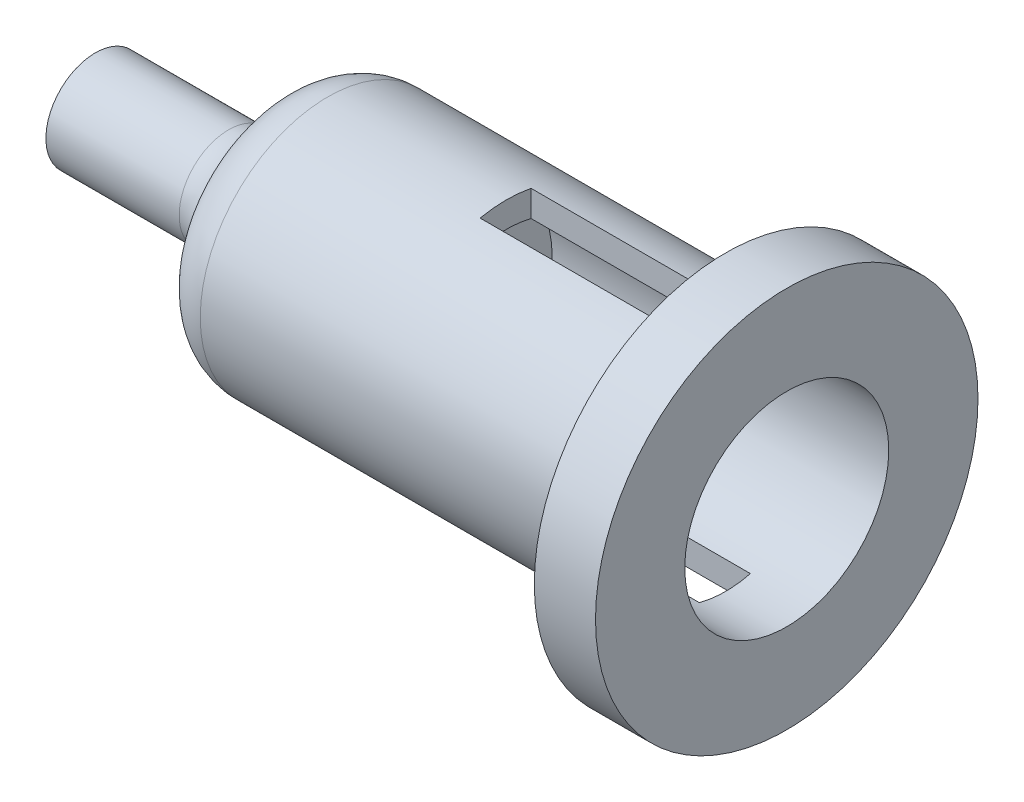
ISO-10303-21;
HEADER;
FILE_DESCRIPTION(('STEP AP214'),'2;1');
FILE_NAME('part.step','',(''),(''),'','','');
FILE_SCHEMA(('AUTOMOTIVE_DESIGN { 1 0 10303 214 1 1 1 1 }'));
ENDSEC;
DATA;
#1=APPLICATION_CONTEXT('core data for automotive mechanical design processes');
#2=APPLICATION_PROTOCOL_DEFINITION('international standard','automotive_design',2000,#1);
#3=PRODUCT_CONTEXT('',#1,'mechanical');
#4=PRODUCT('Part','Part','',(#3));
#5=PRODUCT_RELATED_PRODUCT_CATEGORY('part','',(#4));
#6=PRODUCT_DEFINITION_FORMATION('','',#4);
#7=PRODUCT_DEFINITION_CONTEXT('part definition',#1,'design');
#8=PRODUCT_DEFINITION('design','',#6,#7);
#9=PRODUCT_DEFINITION_SHAPE('','',#8);
#10=(LENGTH_UNIT() NAMED_UNIT(*) SI_UNIT(.MILLI.,.METRE.));
#11=(NAMED_UNIT(*) PLANE_ANGLE_UNIT() SI_UNIT($,.RADIAN.));
#12=(NAMED_UNIT(*) SI_UNIT($,.STERADIAN.) SOLID_ANGLE_UNIT());
#13=UNCERTAINTY_MEASURE_WITH_UNIT(LENGTH_MEASURE(1.E-05),#10,'distance_accuracy_value','');
#14=(GEOMETRIC_REPRESENTATION_CONTEXT(3) GLOBAL_UNCERTAINTY_ASSIGNED_CONTEXT((#13)) GLOBAL_UNIT_ASSIGNED_CONTEXT((#10,
#11,#12)) REPRESENTATION_CONTEXT('',''));
#15=CARTESIAN_POINT('',(0.,0.,0.));
#16=DIRECTION('',(0.,0.,1.));
#17=DIRECTION('',(1.,0.,0.));
#18=AXIS2_PLACEMENT_3D('',#15,#16,#17);
#19=CARTESIAN_POINT('',(-99.3636707278067,0.,0.));
#20=DIRECTION('',(-1.,0.,0.));
#21=DIRECTION('',(0.,0.,1.));
#22=AXIS2_PLACEMENT_3D('',#19,#20,#21);
#23=PLANE('',#22);
#24=CARTESIAN_POINT('',(-99.3636707278067,0.,0.));
#25=DIRECTION('',(1.,0.,0.));
#26=DIRECTION('',(0.,0.,-1.));
#27=AXIS2_PLACEMENT_3D('',#24,#25,#26);
#28=CIRCLE('',#27,9.69102467592188);
#29=CARTESIAN_POINT('',(-99.3636707278067,0.,-9.69102467592188));
#30=VERTEX_POINT('',#29);
#31=EDGE_CURVE('E159',#30,#30,#28,.T.);
#32=ORIENTED_EDGE('',*,*,#31,.F.);
#33=EDGE_LOOP('',(#32));
#34=FACE_BOUND('',#33,.T.);
#35=ADVANCED_FACE('F39',(#34),#23,.T.);
#36=CARTESIAN_POINT('',(-29.7890231832833,0.,0.));
#37=DIRECTION('',(1.,0.,0.));
#38=DIRECTION('',(0.,0.,-1.));
#39=AXIS2_PLACEMENT_3D('',#36,#37,#38);
#40=CYLINDRICAL_SURFACE('',#39,9.69102467592188);
#41=CARTESIAN_POINT('',(-73.2310983680441,0.,0.));
#42=DIRECTION('',(1.,0.,0.));
#43=DIRECTION('',(0.,0.,-1.));
#44=AXIS2_PLACEMENT_3D('',#41,#42,#43);
#45=CIRCLE('',#44,9.69102467592188);
#46=CARTESIAN_POINT('',(-73.2310983680441,0.,-9.69102467592188));
#47=VERTEX_POINT('',#46);
#48=EDGE_CURVE('E146',#47,#47,#45,.F.);
#49=ORIENTED_EDGE('',*,*,#48,.T.);
#50=EDGE_LOOP('',(#49));
#51=FACE_BOUND('',#50,.T.);
#52=ORIENTED_EDGE('',*,*,#31,.T.);
#53=EDGE_LOOP('',(#52));
#54=FACE_BOUND('',#53,.T.);
#55=ADVANCED_FACE('F246',(#51,#54),#40,.T.);
#56=CARTESIAN_POINT('',(-29.7890231832833,0.,0.));
#57=DIRECTION('',(1.,0.,0.));
#58=DIRECTION('',(0.,0.,-1.));
#59=AXIS2_PLACEMENT_3D('',#56,#57,#58);
#60=CYLINDRICAL_SURFACE('',#59,25.);
#61=DIRECTION('',(1.,0.,0.));
#62=VECTOR('',#61,1.);
#63=CARTESIAN_POINT('',(-29.7890231832833,-24.5204109466013,-4.8733404364762));
#64=LINE('',#63,#62);
#65=CARTESIAN_POINT('',(-18.7890231832833,-24.5204109466013,-4.8733404364762));
#66=VERTEX_POINT('',#65);
#67=CARTESIAN_POINT('',(24.2109768167167,-24.5204109466013,-4.8733404364762));
#68=VERTEX_POINT('',#67);
#69=EDGE_CURVE('E189',#66,#68,#64,.T.);
#70=ORIENTED_EDGE('',*,*,#69,.F.);
#71=CARTESIAN_POINT('',(-18.7890231832833,0.,0.));
#72=DIRECTION('',(-1.,0.,0.));
#73=DIRECTION('',(0.,0.,1.));
#74=AXIS2_PLACEMENT_3D('',#71,#72,#73);
#75=CIRCLE('',#74,25.);
#76=CARTESIAN_POINT('',(-18.7890231832833,-24.4687016762175,5.1266595635238));
#77=VERTEX_POINT('',#76);
#78=EDGE_CURVE('E182',#77,#66,#75,.F.);
#79=ORIENTED_EDGE('',*,*,#78,.F.);
#80=DIRECTION('',(1.,0.,0.));
#81=VECTOR('',#80,1.);
#82=CARTESIAN_POINT('',(-29.7890231832833,-24.4687016762175,5.1266595635238));
#83=LINE('',#82,#81);
#84=CARTESIAN_POINT('',(24.2109768167167,-24.4687016762175,5.1266595635238));
#85=VERTEX_POINT('',#84);
#86=EDGE_CURVE('E192',#85,#77,#83,.F.);
#87=ORIENTED_EDGE('',*,*,#86,.F.);
#88=CARTESIAN_POINT('',(24.2109768167167,0.,0.));
#89=DIRECTION('',(1.,0.,0.));
#90=DIRECTION('',(0.,0.,-1.));
#91=AXIS2_PLACEMENT_3D('',#88,#89,#90);
#92=CIRCLE('',#91,25.);
#93=CARTESIAN_POINT('',(24.2109768167167,24.4687016762175,5.1266595635238));
#94=VERTEX_POINT('',#93);
#95=EDGE_CURVE('E123',#94,#85,#92,.T.);
#96=ORIENTED_EDGE('',*,*,#95,.F.);
#97=DIRECTION('',(1.,0.,0.));
#98=VECTOR('',#97,1.);
#99=CARTESIAN_POINT('',(-29.7890231832833,24.4687016762175,5.1266595635238));
#100=LINE('',#99,#98);
#101=CARTESIAN_POINT('',(-18.7890231832833,24.4687016762175,5.1266595635238));
#102=VERTEX_POINT('',#101);
#103=EDGE_CURVE('E195',#102,#94,#100,.T.);
#104=ORIENTED_EDGE('',*,*,#103,.F.);
#105=CARTESIAN_POINT('',(-18.7890231832833,24.5204109466013,-4.8733404364762));
#106=VERTEX_POINT('',#105);
#107=EDGE_CURVE('E183',#106,#102,#75,.F.);
#108=ORIENTED_EDGE('',*,*,#107,.F.);
#109=DIRECTION('',(1.,0.,0.));
#110=VECTOR('',#109,1.);
#111=CARTESIAN_POINT('',(-29.7890231832833,24.5204109466013,-4.8733404364762));
#112=LINE('',#111,#110);
#113=CARTESIAN_POINT('',(24.2109768167167,24.5204109466013,-4.8733404364762));
#114=VERTEX_POINT('',#113);
#115=EDGE_CURVE('E186',#114,#106,#112,.F.);
#116=ORIENTED_EDGE('',*,*,#115,.F.);
#117=EDGE_CURVE('E163',#68,#114,#92,.T.);
#118=ORIENTED_EDGE('',*,*,#117,.F.);
#119=EDGE_LOOP('',(#70,#79,#87,#96,#104,#108,#116,#118));
#120=FACE_BOUND('',#119,.T.);
#121=CARTESIAN_POINT('',(-53.7890231832833,0.,0.));
#122=DIRECTION('',(-1.,0.,0.));
#123=DIRECTION('',(0.,0.,1.));
#124=AXIS2_PLACEMENT_3D('',#121,#122,#123);
#125=CIRCLE('',#124,25.);
#126=CARTESIAN_POINT('',(-53.7890231832833,0.,25.));
#127=VERTEX_POINT('',#126);
#128=EDGE_CURVE('E155',#127,#127,#125,.F.);
#129=ORIENTED_EDGE('',*,*,#128,.T.);
#130=EDGE_LOOP('',(#129));
#131=FACE_BOUND('',#130,.T.);
#132=ADVANCED_FACE('F221',(#120,#131),#60,.T.);
#133=CARTESIAN_POINT('',(24.2109768167167,0.,-25.));
#134=DIRECTION('',(-1.,0.,0.));
#135=DIRECTION('',(0.,0.,1.));
#136=AXIS2_PLACEMENT_3D('',#133,#134,#135);
#137=PLANE('',#136);
#138=ORIENTED_EDGE('',*,*,#117,.T.);
#139=DIRECTION('',(0.,1.,0.));
#140=VECTOR('',#139,1.);
#141=CARTESIAN_POINT('',(24.2109768167167,-37.5,-4.8733404364762));
#142=LINE('',#141,#140);
#143=CARTESIAN_POINT('',(24.2109768167167,19.3971789956737,-4.8733404364762));
#144=VERTEX_POINT('',#143);
#145=EDGE_CURVE('E125',#144,#114,#142,.T.);
#146=ORIENTED_EDGE('',*,*,#145,.F.);
#147=CARTESIAN_POINT('',(24.2109768167167,0.,0.));
#148=DIRECTION('',(1.,0.,0.));
#149=DIRECTION('',(0.,0.,-1.));
#150=AXIS2_PLACEMENT_3D('',#147,#148,#149);
#151=CIRCLE('',#150,20.);
#152=CARTESIAN_POINT('',(24.2109768167167,19.3317707859298,5.1266595635238));
#153=VERTEX_POINT('',#152);
#154=EDGE_CURVE('E133',#144,#153,#151,.T.);
#155=ORIENTED_EDGE('',*,*,#154,.T.);
#156=DIRECTION('',(0.,1.,0.));
#157=VECTOR('',#156,1.);
#158=CARTESIAN_POINT('',(24.2109768167167,-37.5,5.1266595635238));
#159=LINE('',#158,#157);
#160=EDGE_CURVE('E126',#153,#94,#159,.T.);
#161=ORIENTED_EDGE('',*,*,#160,.T.);
#162=ORIENTED_EDGE('',*,*,#95,.T.);
#163=CARTESIAN_POINT('',(24.2109768167167,-19.3317707859298,5.1266595635238));
#164=VERTEX_POINT('',#163);
#165=EDGE_CURVE('E65',#85,#164,#159,.T.);
#166=ORIENTED_EDGE('',*,*,#165,.T.);
#167=CARTESIAN_POINT('',(24.2109768167167,-19.3971789956737,-4.8733404364762));
#168=VERTEX_POINT('',#167);
#169=EDGE_CURVE('E113',#164,#168,#151,.T.);
#170=ORIENTED_EDGE('',*,*,#169,.T.);
#171=EDGE_CURVE('E204',#68,#168,#142,.T.);
#172=ORIENTED_EDGE('',*,*,#171,.F.);
#173=EDGE_LOOP('',(#138,#146,#155,#161,#162,#166,#170,#172));
#174=FACE_BOUND('',#173,.T.);
#175=CARTESIAN_POINT('',(24.2109768167167,0.,0.));
#176=DIRECTION('',(1.,0.,0.));
#177=DIRECTION('',(0.,0.,-1.));
#178=AXIS2_PLACEMENT_3D('',#175,#176,#177);
#179=CIRCLE('',#178,37.5);
#180=CARTESIAN_POINT('',(24.2109768167167,0.,-37.5));
#181=VERTEX_POINT('',#180);
#182=EDGE_CURVE('E166',#181,#181,#179,.T.);
#183=ORIENTED_EDGE('',*,*,#182,.F.);
#184=EDGE_LOOP('',(#183));
#185=FACE_BOUND('',#184,.T.);
#186=ADVANCED_FACE('F117',(#174,#185),#137,.T.);
#187=CARTESIAN_POINT('',(-29.7890231832833,0.,0.));
#188=DIRECTION('',(1.,0.,0.));
#189=DIRECTION('',(0.,0.,-1.));
#190=AXIS2_PLACEMENT_3D('',#187,#188,#189);
#191=CYLINDRICAL_SURFACE('',#190,37.5);
#192=ORIENTED_EDGE('',*,*,#182,.T.);
#193=EDGE_LOOP('',(#192));
#194=FACE_BOUND('',#193,.T.);
#195=CARTESIAN_POINT('',(36.2109768167167,0.,0.));
#196=DIRECTION('',(1.,0.,0.));
#197=DIRECTION('',(0.,0.,-1.));
#198=AXIS2_PLACEMENT_3D('',#195,#196,#197);
#199=CIRCLE('',#198,37.5);
#200=CARTESIAN_POINT('',(36.2109768167167,0.,-37.5));
#201=VERTEX_POINT('',#200);
#202=EDGE_CURVE('E170',#201,#201,#199,.T.);
#203=ORIENTED_EDGE('',*,*,#202,.F.);
#204=EDGE_LOOP('',(#203));
#205=FACE_BOUND('',#204,.T.);
#206=ADVANCED_FACE('F271',(#194,#205),#191,.T.);
#207=CARTESIAN_POINT('',(36.2109768167167,0.,-37.5));
#208=DIRECTION('',(1.,0.,0.));
#209=DIRECTION('',(0.,0.,-1.));
#210=AXIS2_PLACEMENT_3D('',#207,#208,#209);
#211=PLANE('',#210);
#212=ORIENTED_EDGE('',*,*,#202,.T.);
#213=EDGE_LOOP('',(#212));
#214=FACE_BOUND('',#213,.T.);
#215=CARTESIAN_POINT('',(36.2109768167167,0.,0.));
#216=DIRECTION('',(1.,0.,0.));
#217=DIRECTION('',(0.,0.,-1.));
#218=AXIS2_PLACEMENT_3D('',#215,#216,#217);
#219=CIRCLE('',#218,20.);
#220=CARTESIAN_POINT('',(36.2109768167167,0.,-20.));
#221=VERTEX_POINT('',#220);
#222=EDGE_CURVE('E174',#221,#221,#219,.T.);
#223=ORIENTED_EDGE('',*,*,#222,.F.);
#224=EDGE_LOOP('',(#223));
#225=FACE_BOUND('',#224,.T.);
#226=ADVANCED_FACE('F276',(#214,#225),#211,.T.);
#227=CARTESIAN_POINT('',(-29.7890231832833,0.,0.));
#228=DIRECTION('',(1.,0.,0.));
#229=DIRECTION('',(0.,0.,-1.));
#230=AXIS2_PLACEMENT_3D('',#227,#228,#229);
#231=CYLINDRICAL_SURFACE('',#230,20.);
#232=CARTESIAN_POINT('',(-18.7890231832833,0.,0.));
#233=DIRECTION('',(-1.,0.,0.));
#234=DIRECTION('',(0.,0.,1.));
#235=AXIS2_PLACEMENT_3D('',#232,#233,#234);
#236=CIRCLE('',#235,20.);
#237=CARTESIAN_POINT('',(-18.7890231832833,-19.3971789956737,-4.8733404364762));
#238=VERTEX_POINT('',#237);
#239=CARTESIAN_POINT('',(-18.7890231832833,-19.3317707859298,5.1266595635238));
#240=VERTEX_POINT('',#239);
#241=EDGE_CURVE('E11',#238,#240,#236,.T.);
#242=ORIENTED_EDGE('',*,*,#241,.F.);
#243=DIRECTION('',(1.,0.,0.));
#244=VECTOR('',#243,1.);
#245=CARTESIAN_POINT('',(-29.7890231832833,-19.3971789956737,-4.8733404364762));
#246=LINE('',#245,#244);
#247=EDGE_CURVE('E43',#168,#238,#246,.F.);
#248=ORIENTED_EDGE('',*,*,#247,.F.);
#249=ORIENTED_EDGE('',*,*,#169,.F.);
#250=DIRECTION('',(1.,0.,0.));
#251=VECTOR('',#250,1.);
#252=CARTESIAN_POINT('',(-29.7890231832833,-19.3317707859298,5.1266595635238));
#253=LINE('',#252,#251);
#254=EDGE_CURVE('E105',#240,#164,#253,.T.);
#255=ORIENTED_EDGE('',*,*,#254,.F.);
#256=EDGE_LOOP('',(#242,#248,#249,#255));
#257=FACE_BOUND('',#256,.T.);
#258=CARTESIAN_POINT('',(-18.7890231832833,19.3317707859298,5.1266595635238));
#259=VERTEX_POINT('',#258);
#260=CARTESIAN_POINT('',(-18.7890231832833,19.3971789956737,-4.8733404364762));
#261=VERTEX_POINT('',#260);
#262=EDGE_CURVE('E50',#259,#261,#236,.T.);
#263=ORIENTED_EDGE('',*,*,#262,.F.);
#264=DIRECTION('',(1.,0.,0.));
#265=VECTOR('',#264,1.);
#266=CARTESIAN_POINT('',(-29.7890231832833,19.3317707859298,5.1266595635238));
#267=LINE('',#266,#265);
#268=EDGE_CURVE('E140',#153,#259,#267,.F.);
#269=ORIENTED_EDGE('',*,*,#268,.F.);
#270=ORIENTED_EDGE('',*,*,#154,.F.);
#271=DIRECTION('',(1.,0.,0.));
#272=VECTOR('',#271,1.);
#273=CARTESIAN_POINT('',(-29.7890231832833,19.3971789956737,-4.8733404364762));
#274=LINE('',#273,#272);
#275=EDGE_CURVE('E139',#261,#144,#274,.T.);
#276=ORIENTED_EDGE('',*,*,#275,.F.);
#277=EDGE_LOOP('',(#263,#269,#270,#276));
#278=FACE_BOUND('',#277,.T.);
#279=ORIENTED_EDGE('',*,*,#222,.T.);
#280=EDGE_LOOP('',(#279));
#281=FACE_BOUND('',#280,.T.);
#282=CARTESIAN_POINT('',(-29.7890231832833,0.,0.));
#283=DIRECTION('',(1.,0.,0.));
#284=DIRECTION('',(0.,0.,-1.));
#285=AXIS2_PLACEMENT_3D('',#282,#283,#284);
#286=CIRCLE('',#285,20.);
#287=CARTESIAN_POINT('',(-29.7890231832833,0.,-20.));
#288=VERTEX_POINT('',#287);
#289=EDGE_CURVE('E178',#288,#288,#286,.T.);
#290=ORIENTED_EDGE('',*,*,#289,.F.);
#291=EDGE_LOOP('',(#290));
#292=FACE_BOUND('',#291,.T.);
#293=ADVANCED_FACE('F129',(#257,#278,#281,#292),#231,.F.);
#294=CARTESIAN_POINT('',(-29.7890231832833,0.,-20.));
#295=DIRECTION('',(1.,0.,0.));
#296=DIRECTION('',(0.,0.,-1.));
#297=AXIS2_PLACEMENT_3D('',#294,#295,#296);
#298=PLANE('',#297);
#299=ORIENTED_EDGE('',*,*,#289,.T.);
#300=EDGE_LOOP('',(#299));
#301=FACE_BOUND('',#300,.T.);
#302=ADVANCED_FACE('F257',(#301),#298,.T.);
#303=CARTESIAN_POINT('',(-53.7890231832833,0.,0.));
#304=DIRECTION('',(-1.,0.,0.));
#305=DIRECTION('',(0.,0.,1.));
#306=AXIS2_PLACEMENT_3D('',#303,#304,#305);
#307=TOROIDAL_SURFACE('',#306,15.,10.);
#308=CARTESIAN_POINT('',(-63.5100607756638,0.,0.));
#309=DIRECTION('',(1.,0.,0.));
#310=DIRECTION('',(0.,0.,-1.));
#311=AXIS2_PLACEMENT_3D('',#308,#309,#310);
#312=CIRCLE('',#311,17.345512337961);
#313=CARTESIAN_POINT('',(-63.5100607756638,0.,-17.345512337961));
#314=VERTEX_POINT('',#313);
#315=EDGE_CURVE('E149',#314,#314,#312,.T.);
#316=ORIENTED_EDGE('',*,*,#315,.T.);
#317=EDGE_LOOP('',(#316));
#318=FACE_BOUND('',#317,.T.);
#319=ORIENTED_EDGE('',*,*,#128,.F.);
#320=EDGE_LOOP('',(#319));
#321=FACE_BOUND('',#320,.T.);
#322=ADVANCED_FACE('F240',(#318,#321),#307,.T.);
#323=CARTESIAN_POINT('',(-73.2310983680441,0.,0.));
#324=DIRECTION('',(1.,0.,0.));
#325=DIRECTION('',(0.,0.,-1.));
#326=AXIS2_PLACEMENT_3D('',#323,#324,#325);
#327=TOROIDAL_SURFACE('',#326,19.6910246759219,10.);
#328=ORIENTED_EDGE('',*,*,#48,.F.);
#329=EDGE_LOOP('',(#328));
#330=FACE_BOUND('',#329,.T.);
#331=ORIENTED_EDGE('',*,*,#315,.F.);
#332=EDGE_LOOP('',(#331));
#333=FACE_BOUND('',#332,.T.);
#334=ADVANCED_FACE('F41',(#330,#333),#327,.F.);
#335=CARTESIAN_POINT('',(-18.7890231832833,-37.5,5.1266595635238));
#336=DIRECTION('',(0.,0.,1.));
#337=DIRECTION('',(1.,0.,0.));
#338=AXIS2_PLACEMENT_3D('',#335,#336,#337);
#339=PLANE('',#338);
#340=ORIENTED_EDGE('',*,*,#103,.T.);
#341=ORIENTED_EDGE('',*,*,#160,.F.);
#342=ORIENTED_EDGE('',*,*,#268,.T.);
#343=DIRECTION('',(0.,1.,0.));
#344=VECTOR('',#343,1.);
#345=CARTESIAN_POINT('',(-18.7890231832833,-37.5,5.1266595635238));
#346=LINE('',#345,#344);
#347=EDGE_CURVE('E57',#259,#102,#346,.T.);
#348=ORIENTED_EDGE('',*,*,#347,.T.);
#349=EDGE_LOOP('',(#340,#341,#342,#348));
#350=FACE_BOUND('',#349,.T.);
#351=ADVANCED_FACE('F232',(#350),#339,.F.);
#352=CARTESIAN_POINT('',(-18.7890231832833,-37.5,-4.8733404364762));
#353=DIRECTION('',(0.,0.,-1.));
#354=DIRECTION('',(-1.,0.,0.));
#355=AXIS2_PLACEMENT_3D('',#352,#353,#354);
#356=PLANE('',#355);
#357=ORIENTED_EDGE('',*,*,#115,.T.);
#358=DIRECTION('',(0.,1.,0.));
#359=VECTOR('',#358,1.);
#360=CARTESIAN_POINT('',(-18.7890231832833,-37.5,-4.8733404364762));
#361=LINE('',#360,#359);
#362=EDGE_CURVE('E205',#261,#106,#361,.T.);
#363=ORIENTED_EDGE('',*,*,#362,.F.);
#364=ORIENTED_EDGE('',*,*,#275,.T.);
#365=ORIENTED_EDGE('',*,*,#145,.T.);
#366=EDGE_LOOP('',(#357,#363,#364,#365));
#367=FACE_BOUND('',#366,.T.);
#368=ADVANCED_FACE('F226',(#367),#356,.F.);
#369=CARTESIAN_POINT('',(-18.7890231832833,-37.5,-4.8733404364762));
#370=DIRECTION('',(-1.,0.,0.));
#371=DIRECTION('',(0.,0.,1.));
#372=AXIS2_PLACEMENT_3D('',#369,#370,#371);
#373=PLANE('',#372);
#374=ORIENTED_EDGE('',*,*,#107,.T.);
#375=ORIENTED_EDGE('',*,*,#347,.F.);
#376=ORIENTED_EDGE('',*,*,#262,.T.);
#377=ORIENTED_EDGE('',*,*,#362,.T.);
#378=EDGE_LOOP('',(#374,#375,#376,#377));
#379=FACE_BOUND('',#378,.T.);
#380=ADVANCED_FACE('F231',(#379),#373,.F.);
#381=ORIENTED_EDGE('',*,*,#86,.T.);
#382=EDGE_CURVE('E108',#77,#240,#346,.T.);
#383=ORIENTED_EDGE('',*,*,#382,.T.);
#384=ORIENTED_EDGE('',*,*,#254,.T.);
#385=ORIENTED_EDGE('',*,*,#165,.F.);
#386=EDGE_LOOP('',(#381,#383,#384,#385));
#387=FACE_BOUND('',#386,.T.);
#388=ADVANCED_FACE('F106',(#387),#339,.F.);
#389=ORIENTED_EDGE('',*,*,#78,.T.);
#390=EDGE_CURVE('E198',#66,#238,#361,.T.);
#391=ORIENTED_EDGE('',*,*,#390,.T.);
#392=ORIENTED_EDGE('',*,*,#241,.T.);
#393=ORIENTED_EDGE('',*,*,#382,.F.);
#394=EDGE_LOOP('',(#389,#391,#392,#393));
#395=FACE_BOUND('',#394,.T.);
#396=ADVANCED_FACE('F244',(#395),#373,.F.);
#397=ORIENTED_EDGE('',*,*,#69,.T.);
#398=ORIENTED_EDGE('',*,*,#171,.T.);
#399=ORIENTED_EDGE('',*,*,#247,.T.);
#400=ORIENTED_EDGE('',*,*,#390,.F.);
#401=EDGE_LOOP('',(#397,#398,#399,#400));
#402=FACE_BOUND('',#401,.T.);
#403=ADVANCED_FACE('F215',(#402),#356,.F.);
#404=CLOSED_SHELL('',(#35,#55,#132,#186,#206,#226,#293,#302,#322,#334,#351,#368,#380,#388,#396,#403));
#405=MANIFOLD_SOLID_BREP('B2',#404);
#406=ADVANCED_BREP_SHAPE_REPRESENTATION('',(#18,#405),#14);
#407=SHAPE_DEFINITION_REPRESENTATION(#9,#406);
ENDSEC;
END-ISO-10303-21;
